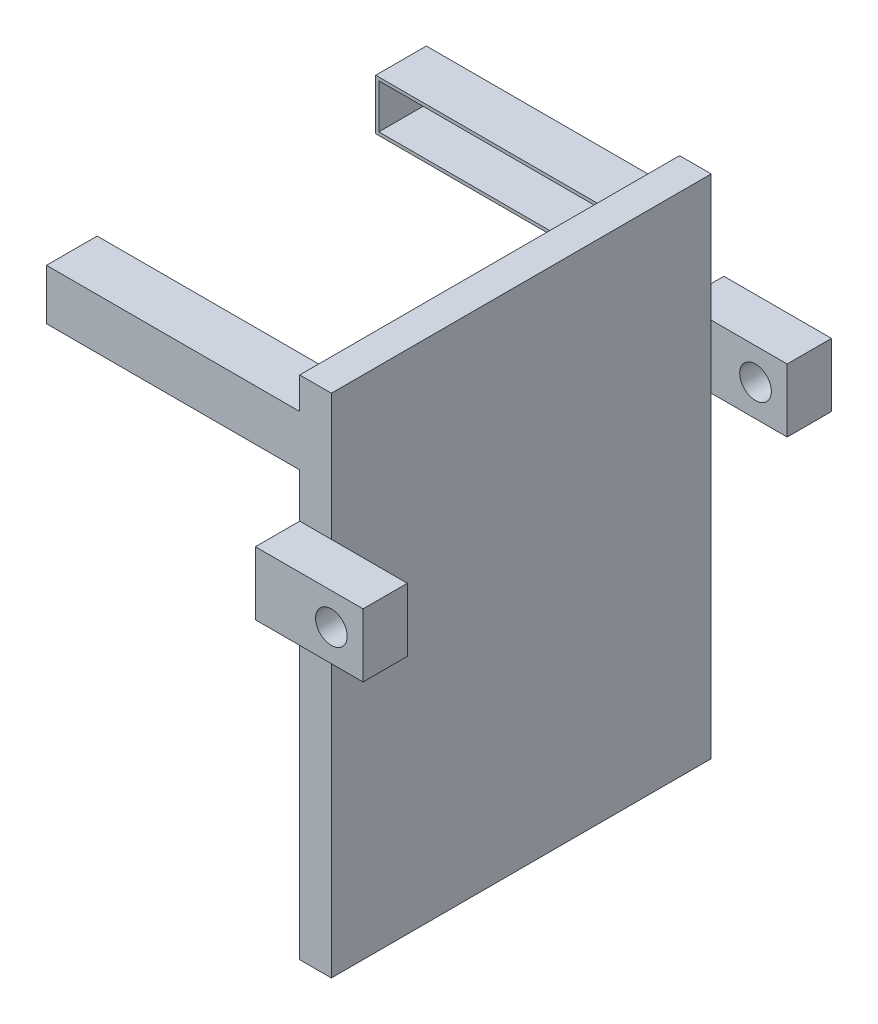
ISO-10303-21;
HEADER;
FILE_DESCRIPTION(('STEP AP214'),'2;1');
FILE_NAME('part.step','',(''),(''),'','','');
FILE_SCHEMA(('AUTOMOTIVE_DESIGN { 1 0 10303 214 1 1 1 1 }'));
ENDSEC;
DATA;
#1=APPLICATION_CONTEXT('core data for automotive mechanical design processes');
#2=APPLICATION_PROTOCOL_DEFINITION('international standard','automotive_design',2000,#1);
#3=PRODUCT_CONTEXT('',#1,'mechanical');
#4=PRODUCT('Part','Part','',(#3));
#5=PRODUCT_RELATED_PRODUCT_CATEGORY('part','',(#4));
#6=PRODUCT_DEFINITION_FORMATION('','',#4);
#7=PRODUCT_DEFINITION_CONTEXT('part definition',#1,'design');
#8=PRODUCT_DEFINITION('design','',#6,#7);
#9=PRODUCT_DEFINITION_SHAPE('','',#8);
#10=(LENGTH_UNIT() NAMED_UNIT(*) SI_UNIT(.MILLI.,.METRE.));
#11=(NAMED_UNIT(*) PLANE_ANGLE_UNIT() SI_UNIT($,.RADIAN.));
#12=(NAMED_UNIT(*) SI_UNIT($,.STERADIAN.) SOLID_ANGLE_UNIT());
#13=UNCERTAINTY_MEASURE_WITH_UNIT(LENGTH_MEASURE(1.E-05),#10,'distance_accuracy_value','');
#14=(GEOMETRIC_REPRESENTATION_CONTEXT(3) GLOBAL_UNCERTAINTY_ASSIGNED_CONTEXT((#13)) GLOBAL_UNIT_ASSIGNED_CONTEXT((#10,
#11,#12)) REPRESENTATION_CONTEXT('',''));
#15=CARTESIAN_POINT('',(0.,0.,0.));
#16=DIRECTION('',(0.,0.,1.));
#17=DIRECTION('',(1.,0.,0.));
#18=AXIS2_PLACEMENT_3D('',#15,#16,#17);
#19=CARTESIAN_POINT('',(0.,0.,-4.4));
#20=DIRECTION('',(0.,0.,1.));
#21=DIRECTION('',(-1.,0.,0.));
#22=AXIS2_PLACEMENT_3D('',#19,#20,#21);
#23=PLANE('',#22);
#24=DIRECTION('',(0.,1.,0.));
#25=VECTOR('',#24,1.);
#26=CARTESIAN_POINT('',(0.,0.4,-4.4));
#27=LINE('',#26,#25);
#28=CARTESIAN_POINT('',(0.,-0.4,-4.4));
#29=VERTEX_POINT('',#28);
#30=CARTESIAN_POINT('',(0.,0.4,-4.4));
#31=VERTEX_POINT('',#30);
#32=EDGE_CURVE('E309',#29,#31,#27,.T.);
#33=ORIENTED_EDGE('',*,*,#32,.T.);
#34=DIRECTION('',(-1.,0.,0.));
#35=VECTOR('',#34,1.);
#36=CARTESIAN_POINT('',(-4.,0.4,-4.4));
#37=LINE('',#36,#35);
#38=CARTESIAN_POINT('',(-4.,0.4,-4.4));
#39=VERTEX_POINT('',#38);
#40=EDGE_CURVE('E314',#31,#39,#37,.T.);
#41=ORIENTED_EDGE('',*,*,#40,.T.);
#42=DIRECTION('',(0.,-1.,0.));
#43=VECTOR('',#42,1.);
#44=CARTESIAN_POINT('',(-4.,-0.4,-4.4));
#45=LINE('',#44,#43);
#46=CARTESIAN_POINT('',(-4.,-0.4,-4.4));
#47=VERTEX_POINT('',#46);
#48=EDGE_CURVE('E326',#39,#47,#45,.T.);
#49=ORIENTED_EDGE('',*,*,#48,.T.);
#50=DIRECTION('',(1.,0.,0.));
#51=VECTOR('',#50,1.);
#52=CARTESIAN_POINT('',(0.,-0.4,-4.4));
#53=LINE('',#52,#51);
#54=EDGE_CURVE('E323',#47,#29,#53,.T.);
#55=ORIENTED_EDGE('',*,*,#54,.T.);
#56=EDGE_LOOP('',(#33,#41,#49,#55));
#57=FACE_BOUND('',#56,.T.);
#58=DIRECTION('',(-1.,0.,0.));
#59=VECTOR('',#58,1.);
#60=CARTESIAN_POINT('',(-0.05,-0.35,-4.4));
#61=LINE('',#60,#59);
#62=CARTESIAN_POINT('',(-0.05,-0.35,-4.4));
#63=VERTEX_POINT('',#62);
#64=CARTESIAN_POINT('',(-3.95,-0.35,-4.4));
#65=VERTEX_POINT('',#64);
#66=EDGE_CURVE('E267',#63,#65,#61,.T.);
#67=ORIENTED_EDGE('',*,*,#66,.T.);
#68=DIRECTION('',(0.,1.,0.));
#69=VECTOR('',#68,1.);
#70=CARTESIAN_POINT('',(-3.95,0.350000000000001,-4.4));
#71=LINE('',#70,#69);
#72=CARTESIAN_POINT('',(-3.95,0.350000000000001,-4.4));
#73=VERTEX_POINT('',#72);
#74=EDGE_CURVE('E57',#65,#73,#71,.T.);
#75=ORIENTED_EDGE('',*,*,#74,.T.);
#76=DIRECTION('',(1.,0.,0.));
#77=VECTOR('',#76,1.);
#78=CARTESIAN_POINT('',(-3.95,0.350000000000001,-4.4));
#79=LINE('',#78,#77);
#80=CARTESIAN_POINT('',(-0.05,0.35,-4.4));
#81=VERTEX_POINT('',#80);
#82=EDGE_CURVE('E258',#73,#81,#79,.T.);
#83=ORIENTED_EDGE('',*,*,#82,.T.);
#84=DIRECTION('',(0.,-1.,0.));
#85=VECTOR('',#84,1.);
#86=CARTESIAN_POINT('',(-0.05,-0.35,-4.4));
#87=LINE('',#86,#85);
#88=EDGE_CURVE('E261',#81,#63,#87,.T.);
#89=ORIENTED_EDGE('',*,*,#88,.T.);
#90=EDGE_LOOP('',(#67,#75,#83,#89));
#91=FACE_BOUND('',#90,.T.);
#92=ADVANCED_FACE('F39',(#57,#91),#23,.T.);
#93=CARTESIAN_POINT('',(0.,0.,-5.2));
#94=DIRECTION('',(0.,0.,-1.));
#95=DIRECTION('',(-1.,0.,0.));
#96=AXIS2_PLACEMENT_3D('',#93,#94,#95);
#97=PLANE('',#96);
#98=DIRECTION('',(0.,-1.,0.));
#99=VECTOR('',#98,1.);
#100=CARTESIAN_POINT('',(0.,-7.1,-5.2));
#101=LINE('',#100,#99);
#102=CARTESIAN_POINT('',(0.,-2.1,-5.2));
#103=VERTEX_POINT('',#102);
#104=CARTESIAN_POINT('',(0.,-7.1,-5.2));
#105=VERTEX_POINT('',#104);
#106=EDGE_CURVE('E420',#103,#105,#101,.T.);
#107=ORIENTED_EDGE('',*,*,#106,.F.);
#108=DIRECTION('',(1.,0.,0.));
#109=VECTOR('',#108,1.);
#110=CARTESIAN_POINT('',(1.7,-2.1,-5.2));
#111=LINE('',#110,#109);
#112=CARTESIAN_POINT('',(0.5,-2.1,-5.2));
#113=VERTEX_POINT('',#112);
#114=EDGE_CURVE('E296',#103,#113,#111,.T.);
#115=ORIENTED_EDGE('',*,*,#114,.T.);
#116=DIRECTION('',(0.,1.,0.));
#117=VECTOR('',#116,1.);
#118=CARTESIAN_POINT('',(0.5,0.9,-5.2));
#119=LINE('',#118,#117);
#120=CARTESIAN_POINT('',(0.5,-7.1,-5.2));
#121=VERTEX_POINT('',#120);
#122=EDGE_CURVE('E413',#121,#113,#119,.T.);
#123=ORIENTED_EDGE('',*,*,#122,.F.);
#124=DIRECTION('',(1.,0.,0.));
#125=VECTOR('',#124,1.);
#126=CARTESIAN_POINT('',(0.5,-7.1,-5.2));
#127=LINE('',#126,#125);
#128=EDGE_CURVE('E408',#105,#121,#127,.T.);
#129=ORIENTED_EDGE('',*,*,#128,.F.);
#130=EDGE_LOOP('',(#107,#115,#123,#129));
#131=FACE_BOUND('',#130,.T.);
#132=ADVANCED_FACE('F535',(#131),#97,.T.);
#133=CARTESIAN_POINT('',(0.5,-1.1,-5.2));
#134=VERTEX_POINT('',#133);
#135=CARTESIAN_POINT('',(0.5,0.9,-5.2));
#136=VERTEX_POINT('',#135);
#137=EDGE_CURVE('E411',#134,#136,#119,.T.);
#138=ORIENTED_EDGE('',*,*,#137,.F.);
#139=DIRECTION('',(-1.,0.,0.));
#140=VECTOR('',#139,1.);
#141=CARTESIAN_POINT('',(0.,-1.1,-5.2));
#142=LINE('',#141,#140);
#143=CARTESIAN_POINT('',(0.,-1.1,-5.2));
#144=VERTEX_POINT('',#143);
#145=EDGE_CURVE('E11',#134,#144,#142,.T.);
#146=ORIENTED_EDGE('',*,*,#145,.T.);
#147=CARTESIAN_POINT('',(0.,-0.4,-5.2));
#148=VERTEX_POINT('',#147);
#149=EDGE_CURVE('E424',#148,#144,#101,.T.);
#150=ORIENTED_EDGE('',*,*,#149,.F.);
#151=DIRECTION('',(1.,0.,0.));
#152=VECTOR('',#151,1.);
#153=CARTESIAN_POINT('',(0.,-0.4,-5.2));
#154=LINE('',#153,#152);
#155=CARTESIAN_POINT('',(-4.,-0.4,-5.2));
#156=VERTEX_POINT('',#155);
#157=EDGE_CURVE('E310',#156,#148,#154,.T.);
#158=ORIENTED_EDGE('',*,*,#157,.F.);
#159=DIRECTION('',(0.,-1.,0.));
#160=VECTOR('',#159,1.);
#161=CARTESIAN_POINT('',(-4.,-0.4,-5.2));
#162=LINE('',#161,#160);
#163=CARTESIAN_POINT('',(-4.,0.4,-5.2));
#164=VERTEX_POINT('',#163);
#165=EDGE_CURVE('E313',#164,#156,#162,.T.);
#166=ORIENTED_EDGE('',*,*,#165,.F.);
#167=DIRECTION('',(-1.,0.,0.));
#168=VECTOR('',#167,1.);
#169=CARTESIAN_POINT('',(-4.,0.4,-5.2));
#170=LINE('',#169,#168);
#171=CARTESIAN_POINT('',(0.,0.4,-5.2));
#172=VERTEX_POINT('',#171);
#173=EDGE_CURVE('E317',#172,#164,#170,.T.);
#174=ORIENTED_EDGE('',*,*,#173,.F.);
#175=CARTESIAN_POINT('',(0.,0.9,-5.2));
#176=VERTEX_POINT('',#175);
#177=EDGE_CURVE('E421',#176,#172,#101,.T.);
#178=ORIENTED_EDGE('',*,*,#177,.F.);
#179=DIRECTION('',(-1.,0.,0.));
#180=VECTOR('',#179,1.);
#181=CARTESIAN_POINT('',(0.5,0.9,-5.2));
#182=LINE('',#181,#180);
#183=EDGE_CURVE('E416',#136,#176,#182,.T.);
#184=ORIENTED_EDGE('',*,*,#183,.F.);
#185=EDGE_LOOP('',(#138,#146,#150,#158,#166,#174,#178,#184));
#186=FACE_BOUND('',#185,.T.);
#187=ADVANCED_FACE('F546',(#186),#97,.T.);
#188=CARTESIAN_POINT('',(0.,0.,0.8));
#189=DIRECTION('',(0.,0.,-1.));
#190=DIRECTION('',(-1.,0.,0.));
#191=AXIS2_PLACEMENT_3D('',#188,#189,#190);
#192=PLANE('',#191);
#193=DIRECTION('',(1.,0.,0.));
#194=VECTOR('',#193,1.);
#195=CARTESIAN_POINT('',(1.7,-2.1,0.8));
#196=LINE('',#195,#194);
#197=CARTESIAN_POINT('',(0.,-2.1,0.8));
#198=VERTEX_POINT('',#197);
#199=CARTESIAN_POINT('',(0.5,-2.1,0.8));
#200=VERTEX_POINT('',#199);
#201=EDGE_CURVE('E357',#198,#200,#196,.T.);
#202=ORIENTED_EDGE('',*,*,#201,.F.);
#203=DIRECTION('',(0.,-1.,0.));
#204=VECTOR('',#203,1.);
#205=CARTESIAN_POINT('',(0.,-7.1,0.8));
#206=LINE('',#205,#204);
#207=CARTESIAN_POINT('',(0.,-7.1,0.8));
#208=VERTEX_POINT('',#207);
#209=EDGE_CURVE('E435',#198,#208,#206,.T.);
#210=ORIENTED_EDGE('',*,*,#209,.T.);
#211=DIRECTION('',(1.,0.,0.));
#212=VECTOR('',#211,1.);
#213=CARTESIAN_POINT('',(0.5,-7.1,0.8));
#214=LINE('',#213,#212);
#215=CARTESIAN_POINT('',(0.5,-7.1,0.8));
#216=VERTEX_POINT('',#215);
#217=EDGE_CURVE('E401',#208,#216,#214,.T.);
#218=ORIENTED_EDGE('',*,*,#217,.T.);
#219=DIRECTION('',(0.,1.,0.));
#220=VECTOR('',#219,1.);
#221=CARTESIAN_POINT('',(0.5,0.9,0.8));
#222=LINE('',#221,#220);
#223=EDGE_CURVE('E428',#216,#200,#222,.T.);
#224=ORIENTED_EDGE('',*,*,#223,.T.);
#225=EDGE_LOOP('',(#202,#210,#218,#224));
#226=FACE_BOUND('',#225,.T.);
#227=ADVANCED_FACE('F526',(#226),#192,.F.);
#228=DIRECTION('',(-1.,0.,0.));
#229=VECTOR('',#228,1.);
#230=CARTESIAN_POINT('',(0.,-1.1,0.8));
#231=LINE('',#230,#229);
#232=CARTESIAN_POINT('',(0.5,-1.1,0.8));
#233=VERTEX_POINT('',#232);
#234=CARTESIAN_POINT('',(0.,-1.1,0.8));
#235=VERTEX_POINT('',#234);
#236=EDGE_CURVE('E48',#233,#235,#231,.T.);
#237=ORIENTED_EDGE('',*,*,#236,.F.);
#238=CARTESIAN_POINT('',(0.5,0.9,0.8));
#239=VERTEX_POINT('',#238);
#240=EDGE_CURVE('E427',#233,#239,#222,.T.);
#241=ORIENTED_EDGE('',*,*,#240,.T.);
#242=DIRECTION('',(-1.,0.,0.));
#243=VECTOR('',#242,1.);
#244=CARTESIAN_POINT('',(0.5,0.9,0.8));
#245=LINE('',#244,#243);
#246=CARTESIAN_POINT('',(0.,0.9,0.8));
#247=VERTEX_POINT('',#246);
#248=EDGE_CURVE('E431',#239,#247,#245,.T.);
#249=ORIENTED_EDGE('',*,*,#248,.T.);
#250=CARTESIAN_POINT('',(0.,0.4,0.8));
#251=VERTEX_POINT('',#250);
#252=EDGE_CURVE('E412',#247,#251,#206,.T.);
#253=ORIENTED_EDGE('',*,*,#252,.T.);
#254=DIRECTION('',(-1.,0.,0.));
#255=VECTOR('',#254,1.);
#256=CARTESIAN_POINT('',(-4.,0.4,0.8));
#257=LINE('',#256,#255);
#258=CARTESIAN_POINT('',(-4.,0.4,0.8));
#259=VERTEX_POINT('',#258);
#260=EDGE_CURVE('E449',#251,#259,#257,.T.);
#261=ORIENTED_EDGE('',*,*,#260,.T.);
#262=DIRECTION('',(0.,-1.,0.));
#263=VECTOR('',#262,1.);
#264=CARTESIAN_POINT('',(-4.,-0.4,0.8));
#265=LINE('',#264,#263);
#266=CARTESIAN_POINT('',(-4.,-0.4,0.8));
#267=VERTEX_POINT('',#266);
#268=EDGE_CURVE('E451',#259,#267,#265,.T.);
#269=ORIENTED_EDGE('',*,*,#268,.T.);
#270=DIRECTION('',(1.,0.,0.));
#271=VECTOR('',#270,1.);
#272=CARTESIAN_POINT('',(0.,-0.4,0.8));
#273=LINE('',#272,#271);
#274=CARTESIAN_POINT('',(0.,-0.4,0.8));
#275=VERTEX_POINT('',#274);
#276=EDGE_CURVE('E454',#267,#275,#273,.T.);
#277=ORIENTED_EDGE('',*,*,#276,.T.);
#278=EDGE_CURVE('E438',#275,#235,#206,.T.);
#279=ORIENTED_EDGE('',*,*,#278,.T.);
#280=EDGE_LOOP('',(#237,#241,#249,#253,#261,#269,#277,#279));
#281=FACE_BOUND('',#280,.T.);
#282=ADVANCED_FACE('F506',(#281),#192,.F.);
#283=CARTESIAN_POINT('',(-4.,0.4,0.8));
#284=DIRECTION('',(0.,-1.,0.));
#285=DIRECTION('',(1.,0.,0.));
#286=AXIS2_PLACEMENT_3D('',#283,#284,#285);
#287=PLANE('',#286);
#288=DIRECTION('',(-1.,0.,0.));
#289=VECTOR('',#288,1.);
#290=CARTESIAN_POINT('',(-4.,0.4,0.));
#291=LINE('',#290,#289);
#292=CARTESIAN_POINT('',(0.,0.4,0.));
#293=VERTEX_POINT('',#292);
#294=CARTESIAN_POINT('',(-4.,0.4,0.));
#295=VERTEX_POINT('',#294);
#296=EDGE_CURVE('E459',#293,#295,#291,.T.);
#297=ORIENTED_EDGE('',*,*,#296,.T.);
#298=DIRECTION('',(0.,0.,-1.));
#299=VECTOR('',#298,1.);
#300=CARTESIAN_POINT('',(-4.,0.4,0.8));
#301=LINE('',#300,#299);
#302=EDGE_CURVE('E469',#259,#295,#301,.T.);
#303=ORIENTED_EDGE('',*,*,#302,.F.);
#304=ORIENTED_EDGE('',*,*,#260,.F.);
#305=DIRECTION('',(0.,0.,-1.));
#306=VECTOR('',#305,1.);
#307=CARTESIAN_POINT('',(0.,0.4,0.8));
#308=LINE('',#307,#306);
#309=EDGE_CURVE('E43',#251,#293,#308,.T.);
#310=ORIENTED_EDGE('',*,*,#309,.T.);
#311=EDGE_LOOP('',(#297,#303,#304,#310));
#312=FACE_BOUND('',#311,.T.);
#313=ADVANCED_FACE('F41',(#312),#287,.F.);
#314=CARTESIAN_POINT('',(-4.,-0.4,0.8));
#315=DIRECTION('',(1.,0.,0.));
#316=DIRECTION('',(0.,0.,-1.));
#317=AXIS2_PLACEMENT_3D('',#314,#315,#316);
#318=PLANE('',#317);
#319=DIRECTION('',(0.,-1.,0.));
#320=VECTOR('',#319,1.);
#321=CARTESIAN_POINT('',(-4.,-0.4,0.));
#322=LINE('',#321,#320);
#323=CARTESIAN_POINT('',(-4.,-0.4,0.));
#324=VERTEX_POINT('',#323);
#325=EDGE_CURVE('E461',#295,#324,#322,.T.);
#326=ORIENTED_EDGE('',*,*,#325,.T.);
#327=DIRECTION('',(0.,0.,-1.));
#328=VECTOR('',#327,1.);
#329=CARTESIAN_POINT('',(-4.,-0.4,0.8));
#330=LINE('',#329,#328);
#331=EDGE_CURVE('E467',#267,#324,#330,.T.);
#332=ORIENTED_EDGE('',*,*,#331,.F.);
#333=ORIENTED_EDGE('',*,*,#268,.F.);
#334=ORIENTED_EDGE('',*,*,#302,.T.);
#335=EDGE_LOOP('',(#326,#332,#333,#334));
#336=FACE_BOUND('',#335,.T.);
#337=ADVANCED_FACE('F519',(#336),#318,.F.);
#338=CARTESIAN_POINT('',(0.,-0.4,0.8));
#339=DIRECTION('',(0.,1.,0.));
#340=DIRECTION('',(-1.,0.,0.));
#341=AXIS2_PLACEMENT_3D('',#338,#339,#340);
#342=PLANE('',#341);
#343=DIRECTION('',(1.,0.,0.));
#344=VECTOR('',#343,1.);
#345=CARTESIAN_POINT('',(0.,-0.4,0.));
#346=LINE('',#345,#344);
#347=CARTESIAN_POINT('',(0.,-0.4,0.));
#348=VERTEX_POINT('',#347);
#349=EDGE_CURVE('E452',#324,#348,#346,.T.);
#350=ORIENTED_EDGE('',*,*,#349,.T.);
#351=DIRECTION('',(0.,0.,-1.));
#352=VECTOR('',#351,1.);
#353=CARTESIAN_POINT('',(0.,-0.4,0.8));
#354=LINE('',#353,#352);
#355=EDGE_CURVE('E456',#275,#348,#354,.T.);
#356=ORIENTED_EDGE('',*,*,#355,.F.);
#357=ORIENTED_EDGE('',*,*,#276,.F.);
#358=ORIENTED_EDGE('',*,*,#331,.T.);
#359=EDGE_LOOP('',(#350,#356,#357,#358));
#360=FACE_BOUND('',#359,.T.);
#361=ADVANCED_FACE('F524',(#360),#342,.F.);
#362=CARTESIAN_POINT('',(0.,0.,0.));
#363=DIRECTION('',(0.,0.,-1.));
#364=DIRECTION('',(-1.,0.,0.));
#365=AXIS2_PLACEMENT_3D('',#362,#363,#364);
#366=PLANE('',#365);
#367=DIRECTION('',(0.,1.,0.));
#368=VECTOR('',#367,1.);
#369=CARTESIAN_POINT('',(-3.95,0.350000000000001,0.));
#370=LINE('',#369,#368);
#371=CARTESIAN_POINT('',(-3.95,-0.35,0.));
#372=VERTEX_POINT('',#371);
#373=CARTESIAN_POINT('',(-3.95,0.350000000000001,0.));
#374=VERTEX_POINT('',#373);
#375=EDGE_CURVE('E375',#372,#374,#370,.T.);
#376=ORIENTED_EDGE('',*,*,#375,.F.);
#377=DIRECTION('',(-1.,0.,0.));
#378=VECTOR('',#377,1.);
#379=CARTESIAN_POINT('',(-0.05,-0.35,0.));
#380=LINE('',#379,#378);
#381=CARTESIAN_POINT('',(-0.05,-0.35,0.));
#382=VERTEX_POINT('',#381);
#383=EDGE_CURVE('E380',#382,#372,#380,.T.);
#384=ORIENTED_EDGE('',*,*,#383,.F.);
#385=DIRECTION('',(0.,-1.,0.));
#386=VECTOR('',#385,1.);
#387=CARTESIAN_POINT('',(-0.05,-0.35,0.));
#388=LINE('',#387,#386);
#389=CARTESIAN_POINT('',(-0.05,0.35,0.));
#390=VERTEX_POINT('',#389);
#391=EDGE_CURVE('E394',#390,#382,#388,.T.);
#392=ORIENTED_EDGE('',*,*,#391,.F.);
#393=DIRECTION('',(1.,0.,0.));
#394=VECTOR('',#393,1.);
#395=CARTESIAN_POINT('',(-3.95,0.350000000000001,0.));
#396=LINE('',#395,#394);
#397=EDGE_CURVE('E391',#374,#390,#396,.T.);
#398=ORIENTED_EDGE('',*,*,#397,.F.);
#399=EDGE_LOOP('',(#376,#384,#392,#398));
#400=FACE_BOUND('',#399,.T.);
#401=DIRECTION('',(0.,1.,0.));
#402=VECTOR('',#401,1.);
#403=CARTESIAN_POINT('',(0.,0.4,0.));
#404=LINE('',#403,#402);
#405=EDGE_CURVE('E442',#348,#293,#404,.T.);
#406=ORIENTED_EDGE('',*,*,#405,.F.);
#407=ORIENTED_EDGE('',*,*,#349,.F.);
#408=ORIENTED_EDGE('',*,*,#325,.F.);
#409=ORIENTED_EDGE('',*,*,#296,.F.);
#410=EDGE_LOOP('',(#406,#407,#408,#409));
#411=FACE_BOUND('',#410,.T.);
#412=ADVANCED_FACE('F698',(#400,#411),#366,.T.);
#413=CARTESIAN_POINT('',(0.,-7.1,-5.2));
#414=DIRECTION('',(-1.,0.,0.));
#415=DIRECTION('',(0.,0.,1.));
#416=AXIS2_PLACEMENT_3D('',#413,#414,#415);
#417=PLANE('',#416);
#418=DIRECTION('',(0.,0.,1.));
#419=VECTOR('',#418,1.);
#420=CARTESIAN_POINT('',(0.,-0.4,-5.2));
#421=LINE('',#420,#419);
#422=EDGE_CURVE('E336',#148,#29,#421,.T.);
#423=ORIENTED_EDGE('',*,*,#422,.F.);
#424=ORIENTED_EDGE('',*,*,#149,.T.);
#425=DIRECTION('',(0.,0.,1.));
#426=VECTOR('',#425,1.);
#427=CARTESIAN_POINT('',(0.,-1.1,-5.9));
#428=LINE('',#427,#426);
#429=CARTESIAN_POINT('',(0.,-1.1,-5.9));
#430=VERTEX_POINT('',#429);
#431=EDGE_CURVE('E65',#430,#144,#428,.T.);
#432=ORIENTED_EDGE('',*,*,#431,.F.);
#433=DIRECTION('',(0.,-1.,0.));
#434=VECTOR('',#433,1.);
#435=CARTESIAN_POINT('',(0.,-1.1,-5.9));
#436=LINE('',#435,#434);
#437=CARTESIAN_POINT('',(0.,-2.1,-5.9));
#438=VERTEX_POINT('',#437);
#439=EDGE_CURVE('E286',#430,#438,#436,.T.);
#440=ORIENTED_EDGE('',*,*,#439,.T.);
#441=DIRECTION('',(0.,0.,1.));
#442=VECTOR('',#441,1.);
#443=CARTESIAN_POINT('',(0.,-2.1,-5.9));
#444=LINE('',#443,#442);
#445=EDGE_CURVE('E307',#438,#103,#444,.T.);
#446=ORIENTED_EDGE('',*,*,#445,.T.);
#447=ORIENTED_EDGE('',*,*,#106,.T.);
#448=DIRECTION('',(0.,0.,1.));
#449=VECTOR('',#448,1.);
#450=CARTESIAN_POINT('',(0.,-7.1,-5.2));
#451=LINE('',#450,#449);
#452=EDGE_CURVE('E439',#105,#208,#451,.T.);
#453=ORIENTED_EDGE('',*,*,#452,.T.);
#454=ORIENTED_EDGE('',*,*,#209,.F.);
#455=DIRECTION('',(0.,0.,-1.));
#456=VECTOR('',#455,1.);
#457=CARTESIAN_POINT('',(0.,-2.1,1.5));
#458=LINE('',#457,#456);
#459=CARTESIAN_POINT('',(0.,-2.1,1.5));
#460=VERTEX_POINT('',#459);
#461=EDGE_CURVE('E356',#460,#198,#458,.T.);
#462=ORIENTED_EDGE('',*,*,#461,.F.);
#463=DIRECTION('',(0.,-1.,0.));
#464=VECTOR('',#463,1.);
#465=CARTESIAN_POINT('',(0.,-1.1,1.5));
#466=LINE('',#465,#464);
#467=CARTESIAN_POINT('',(0.,-1.1,1.5));
#468=VERTEX_POINT('',#467);
#469=EDGE_CURVE('E354',#468,#460,#466,.T.);
#470=ORIENTED_EDGE('',*,*,#469,.F.);
#471=DIRECTION('',(0.,0.,-1.));
#472=VECTOR('',#471,1.);
#473=CARTESIAN_POINT('',(0.,-1.1,1.5));
#474=LINE('',#473,#472);
#475=EDGE_CURVE('E366',#468,#235,#474,.T.);
#476=ORIENTED_EDGE('',*,*,#475,.T.);
#477=ORIENTED_EDGE('',*,*,#278,.F.);
#478=ORIENTED_EDGE('',*,*,#355,.T.);
#479=ORIENTED_EDGE('',*,*,#405,.T.);
#480=ORIENTED_EDGE('',*,*,#309,.F.);
#481=ORIENTED_EDGE('',*,*,#252,.F.);
#482=DIRECTION('',(0.,0.,1.));
#483=VECTOR('',#482,1.);
#484=CARTESIAN_POINT('',(0.,0.9,-5.2));
#485=LINE('',#484,#483);
#486=EDGE_CURVE('E443',#176,#247,#485,.T.);
#487=ORIENTED_EDGE('',*,*,#486,.F.);
#488=ORIENTED_EDGE('',*,*,#177,.T.);
#489=DIRECTION('',(0.,0.,1.));
#490=VECTOR('',#489,1.);
#491=CARTESIAN_POINT('',(0.,0.4,-5.2));
#492=LINE('',#491,#490);
#493=EDGE_CURVE('E320',#172,#31,#492,.T.);
#494=ORIENTED_EDGE('',*,*,#493,.T.);
#495=ORIENTED_EDGE('',*,*,#32,.F.);
#496=EDGE_LOOP('',(#423,#424,#432,#440,#446,#447,#453,#454,#462,#470,#476,#477,#478,#479,#480,
#481,#487,#488,#494,#495));
#497=FACE_BOUND('',#496,.T.);
#498=ADVANCED_FACE('F490',(#497),#417,.T.);
#499=CARTESIAN_POINT('',(0.5,-7.1,-5.2));
#500=DIRECTION('',(0.,-1.,0.));
#501=DIRECTION('',(0.,0.,-1.));
#502=AXIS2_PLACEMENT_3D('',#499,#500,#501);
#503=PLANE('',#502);
#504=ORIENTED_EDGE('',*,*,#217,.F.);
#505=ORIENTED_EDGE('',*,*,#452,.F.);
#506=ORIENTED_EDGE('',*,*,#128,.T.);
#507=DIRECTION('',(0.,0.,1.));
#508=VECTOR('',#507,1.);
#509=CARTESIAN_POINT('',(0.5,-7.1,-5.2));
#510=LINE('',#509,#508);
#511=EDGE_CURVE('E423',#121,#216,#510,.T.);
#512=ORIENTED_EDGE('',*,*,#511,.T.);
#513=EDGE_LOOP('',(#504,#505,#506,#512));
#514=FACE_BOUND('',#513,.T.);
#515=ADVANCED_FACE('F532',(#514),#503,.T.);
#516=CARTESIAN_POINT('',(0.5,0.9,-5.2));
#517=DIRECTION('',(0.,1.,0.));
#518=DIRECTION('',(0.,0.,1.));
#519=AXIS2_PLACEMENT_3D('',#516,#517,#518);
#520=PLANE('',#519);
#521=ORIENTED_EDGE('',*,*,#248,.F.);
#522=DIRECTION('',(0.,0.,1.));
#523=VECTOR('',#522,1.);
#524=CARTESIAN_POINT('',(0.5,0.9,-5.2));
#525=LINE('',#524,#523);
#526=EDGE_CURVE('E445',#136,#239,#525,.T.);
#527=ORIENTED_EDGE('',*,*,#526,.F.);
#528=ORIENTED_EDGE('',*,*,#183,.T.);
#529=ORIENTED_EDGE('',*,*,#486,.T.);
#530=EDGE_LOOP('',(#521,#527,#528,#529));
#531=FACE_BOUND('',#530,.T.);
#532=ADVANCED_FACE('F515',(#531),#520,.T.);
#533=CARTESIAN_POINT('',(0.5,0.9,-5.2));
#534=DIRECTION('',(1.,0.,0.));
#535=DIRECTION('',(0.,0.,-1.));
#536=AXIS2_PLACEMENT_3D('',#533,#534,#535);
#537=PLANE('',#536);
#538=ORIENTED_EDGE('',*,*,#223,.F.);
#539=ORIENTED_EDGE('',*,*,#511,.F.);
#540=ORIENTED_EDGE('',*,*,#122,.T.);
#541=EDGE_CURVE('E417',#113,#134,#119,.T.);
#542=ORIENTED_EDGE('',*,*,#541,.T.);
#543=ORIENTED_EDGE('',*,*,#137,.T.);
#544=ORIENTED_EDGE('',*,*,#526,.T.);
#545=ORIENTED_EDGE('',*,*,#240,.F.);
#546=EDGE_CURVE('E432',#200,#233,#222,.T.);
#547=ORIENTED_EDGE('',*,*,#546,.F.);
#548=EDGE_LOOP('',(#538,#539,#540,#542,#543,#544,#545,#547));
#549=FACE_BOUND('',#548,.T.);
#550=ADVANCED_FACE('F510',(#549),#537,.T.);
#551=CARTESIAN_POINT('',(-3.95,0.350000000000001,0.7));
#552=DIRECTION('',(-1.,0.,0.));
#553=DIRECTION('',(0.,0.,1.));
#554=AXIS2_PLACEMENT_3D('',#551,#552,#553);
#555=PLANE('',#554);
#556=ORIENTED_EDGE('',*,*,#375,.T.);
#557=DIRECTION('',(0.,0.,-1.));
#558=VECTOR('',#557,1.);
#559=CARTESIAN_POINT('',(-3.95,0.350000000000001,0.7));
#560=LINE('',#559,#558);
#561=CARTESIAN_POINT('',(-3.95,0.350000000000001,0.7));
#562=VERTEX_POINT('',#561);
#563=EDGE_CURVE('E389',#562,#374,#560,.T.);
#564=ORIENTED_EDGE('',*,*,#563,.F.);
#565=DIRECTION('',(0.,1.,0.));
#566=VECTOR('',#565,1.);
#567=CARTESIAN_POINT('',(-3.95,0.350000000000001,0.7));
#568=LINE('',#567,#566);
#569=CARTESIAN_POINT('',(-3.95,-0.35,0.7));
#570=VERTEX_POINT('',#569);
#571=EDGE_CURVE('E376',#570,#562,#568,.T.);
#572=ORIENTED_EDGE('',*,*,#571,.F.);
#573=DIRECTION('',(0.,0.,-1.));
#574=VECTOR('',#573,1.);
#575=CARTESIAN_POINT('',(-3.95,-0.35,0.7));
#576=LINE('',#575,#574);
#577=EDGE_CURVE('E399',#570,#372,#576,.T.);
#578=ORIENTED_EDGE('',*,*,#577,.T.);
#579=EDGE_LOOP('',(#556,#564,#572,#578));
#580=FACE_BOUND('',#579,.T.);
#581=ADVANCED_FACE('F683',(#580),#555,.F.);
#582=CARTESIAN_POINT('',(-0.05,-0.35,0.7));
#583=DIRECTION('',(0.,-1.,0.));
#584=DIRECTION('',(0.,0.,-1.));
#585=AXIS2_PLACEMENT_3D('',#582,#583,#584);
#586=PLANE('',#585);
#587=ORIENTED_EDGE('',*,*,#383,.T.);
#588=ORIENTED_EDGE('',*,*,#577,.F.);
#589=DIRECTION('',(-1.,0.,0.));
#590=VECTOR('',#589,1.);
#591=CARTESIAN_POINT('',(-0.05,-0.35,0.7));
#592=LINE('',#591,#590);
#593=CARTESIAN_POINT('',(-0.05,-0.35,0.7));
#594=VERTEX_POINT('',#593);
#595=EDGE_CURVE('E386',#594,#570,#592,.T.);
#596=ORIENTED_EDGE('',*,*,#595,.F.);
#597=DIRECTION('',(0.,0.,-1.));
#598=VECTOR('',#597,1.);
#599=CARTESIAN_POINT('',(-0.05,-0.35,0.7));
#600=LINE('',#599,#598);
#601=EDGE_CURVE('E402',#594,#382,#600,.T.);
#602=ORIENTED_EDGE('',*,*,#601,.T.);
#603=EDGE_LOOP('',(#587,#588,#596,#602));
#604=FACE_BOUND('',#603,.T.);
#605=ADVANCED_FACE('F823',(#604),#586,.F.);
#606=CARTESIAN_POINT('',(-0.05,-0.35,0.7));
#607=DIRECTION('',(1.,0.,0.));
#608=DIRECTION('',(0.,0.,-1.));
#609=AXIS2_PLACEMENT_3D('',#606,#607,#608);
#610=PLANE('',#609);
#611=ORIENTED_EDGE('',*,*,#391,.T.);
#612=ORIENTED_EDGE('',*,*,#601,.F.);
#613=DIRECTION('',(0.,-1.,0.));
#614=VECTOR('',#613,1.);
#615=CARTESIAN_POINT('',(-0.05,-0.35,0.7));
#616=LINE('',#615,#614);
#617=CARTESIAN_POINT('',(-0.05,0.35,0.7));
#618=VERTEX_POINT('',#617);
#619=EDGE_CURVE('E383',#618,#594,#616,.T.);
#620=ORIENTED_EDGE('',*,*,#619,.F.);
#621=DIRECTION('',(0.,0.,-1.));
#622=VECTOR('',#621,1.);
#623=CARTESIAN_POINT('',(-0.05,0.35,0.7));
#624=LINE('',#623,#622);
#625=EDGE_CURVE('E404',#618,#390,#624,.T.);
#626=ORIENTED_EDGE('',*,*,#625,.T.);
#627=EDGE_LOOP('',(#611,#612,#620,#626));
#628=FACE_BOUND('',#627,.T.);
#629=ADVANCED_FACE('F812',(#628),#610,.F.);
#630=CARTESIAN_POINT('',(-3.95,0.350000000000001,0.7));
#631=DIRECTION('',(0.,1.,0.));
#632=DIRECTION('',(-1.,0.,0.));
#633=AXIS2_PLACEMENT_3D('',#630,#631,#632);
#634=PLANE('',#633);
#635=ORIENTED_EDGE('',*,*,#397,.T.);
#636=ORIENTED_EDGE('',*,*,#625,.F.);
#637=DIRECTION('',(1.,0.,0.));
#638=VECTOR('',#637,1.);
#639=CARTESIAN_POINT('',(-3.95,0.350000000000001,0.7));
#640=LINE('',#639,#638);
#641=EDGE_CURVE('E379',#562,#618,#640,.T.);
#642=ORIENTED_EDGE('',*,*,#641,.F.);
#643=ORIENTED_EDGE('',*,*,#563,.T.);
#644=EDGE_LOOP('',(#635,#636,#642,#643));
#645=FACE_BOUND('',#644,.T.);
#646=ADVANCED_FACE('F801',(#645),#634,.F.);
#647=CARTESIAN_POINT('',(0.,0.,0.7));
#648=DIRECTION('',(0.,0.,-1.));
#649=DIRECTION('',(-1.,0.,0.));
#650=AXIS2_PLACEMENT_3D('',#647,#648,#649);
#651=PLANE('',#650);
#652=ORIENTED_EDGE('',*,*,#571,.T.);
#653=ORIENTED_EDGE('',*,*,#641,.T.);
#654=ORIENTED_EDGE('',*,*,#619,.T.);
#655=ORIENTED_EDGE('',*,*,#595,.T.);
#656=EDGE_LOOP('',(#652,#653,#654,#655));
#657=FACE_BOUND('',#656,.T.);
#658=ADVANCED_FACE('F745',(#657),#651,.T.);
#659=CARTESIAN_POINT('',(0.,0.,0.8));
#660=DIRECTION('',(0.,0.,1.));
#661=DIRECTION('',(1.,0.,0.));
#662=AXIS2_PLACEMENT_3D('',#659,#660,#661);
#663=PLANE('',#662);
#664=CARTESIAN_POINT('',(1.2,-1.6,0.8));
#665=DIRECTION('',(0.,0.,-1.));
#666=DIRECTION('',(-1.,0.,0.));
#667=AXIS2_PLACEMENT_3D('',#664,#665,#666);
#668=CIRCLE('',#667,0.25);
#669=CARTESIAN_POINT('',(0.95,-1.6,0.8));
#670=VERTEX_POINT('',#669);
#671=EDGE_CURVE('E339',#670,#670,#668,.T.);
#672=ORIENTED_EDGE('',*,*,#671,.F.);
#673=EDGE_LOOP('',(#672));
#674=FACE_BOUND('',#673,.T.);
#675=CARTESIAN_POINT('',(1.7,-2.1,0.8));
#676=VERTEX_POINT('',#675);
#677=EDGE_CURVE('E343',#200,#676,#196,.T.);
#678=ORIENTED_EDGE('',*,*,#677,.F.);
#679=ORIENTED_EDGE('',*,*,#546,.T.);
#680=CARTESIAN_POINT('',(1.7,-1.1,0.8));
#681=VERTEX_POINT('',#680);
#682=EDGE_CURVE('E350',#681,#233,#231,.T.);
#683=ORIENTED_EDGE('',*,*,#682,.F.);
#684=DIRECTION('',(0.,1.,0.));
#685=VECTOR('',#684,1.);
#686=CARTESIAN_POINT('',(1.7,-2.1,0.8));
#687=LINE('',#686,#685);
#688=EDGE_CURVE('E360',#676,#681,#687,.T.);
#689=ORIENTED_EDGE('',*,*,#688,.F.);
#690=EDGE_LOOP('',(#678,#679,#683,#689));
#691=FACE_BOUND('',#690,.T.);
#692=ADVANCED_FACE('F503',(#674,#691),#663,.F.);
#693=CARTESIAN_POINT('',(1.7,-2.1,1.5));
#694=DIRECTION('',(0.,1.,0.));
#695=DIRECTION('',(-1.,0.,0.));
#696=AXIS2_PLACEMENT_3D('',#693,#694,#695);
#697=PLANE('',#696);
#698=ORIENTED_EDGE('',*,*,#201,.T.);
#699=ORIENTED_EDGE('',*,*,#677,.T.);
#700=DIRECTION('',(0.,0.,-1.));
#701=VECTOR('',#700,1.);
#702=CARTESIAN_POINT('',(1.7,-2.1,1.5));
#703=LINE('',#702,#701);
#704=CARTESIAN_POINT('',(1.7,-2.1,1.5));
#705=VERTEX_POINT('',#704);
#706=EDGE_CURVE('E372',#705,#676,#703,.T.);
#707=ORIENTED_EDGE('',*,*,#706,.F.);
#708=DIRECTION('',(1.,0.,0.));
#709=VECTOR('',#708,1.);
#710=CARTESIAN_POINT('',(1.7,-2.1,1.5));
#711=LINE('',#710,#709);
#712=EDGE_CURVE('E346',#460,#705,#711,.T.);
#713=ORIENTED_EDGE('',*,*,#712,.F.);
#714=ORIENTED_EDGE('',*,*,#461,.T.);
#715=EDGE_LOOP('',(#698,#699,#707,#713,#714));
#716=FACE_BOUND('',#715,.T.);
#717=ADVANCED_FACE('F744',(#716),#697,.F.);
#718=CARTESIAN_POINT('',(1.7,-2.1,1.5));
#719=DIRECTION('',(-1.,0.,0.));
#720=DIRECTION('',(0.,0.,1.));
#721=AXIS2_PLACEMENT_3D('',#718,#719,#720);
#722=PLANE('',#721);
#723=ORIENTED_EDGE('',*,*,#688,.T.);
#724=DIRECTION('',(0.,0.,-1.));
#725=VECTOR('',#724,1.);
#726=CARTESIAN_POINT('',(1.7,-1.1,1.5));
#727=LINE('',#726,#725);
#728=CARTESIAN_POINT('',(1.7,-1.1,1.5));
#729=VERTEX_POINT('',#728);
#730=EDGE_CURVE('E369',#729,#681,#727,.T.);
#731=ORIENTED_EDGE('',*,*,#730,.F.);
#732=DIRECTION('',(0.,1.,0.));
#733=VECTOR('',#732,1.);
#734=CARTESIAN_POINT('',(1.7,-2.1,1.5));
#735=LINE('',#734,#733);
#736=EDGE_CURVE('E349',#705,#729,#735,.T.);
#737=ORIENTED_EDGE('',*,*,#736,.F.);
#738=ORIENTED_EDGE('',*,*,#706,.T.);
#739=EDGE_LOOP('',(#723,#731,#737,#738));
#740=FACE_BOUND('',#739,.T.);
#741=ADVANCED_FACE('F757',(#740),#722,.F.);
#742=CARTESIAN_POINT('',(0.,-1.1,1.5));
#743=DIRECTION('',(0.,-1.,0.));
#744=DIRECTION('',(0.,0.,-1.));
#745=AXIS2_PLACEMENT_3D('',#742,#743,#744);
#746=PLANE('',#745);
#747=ORIENTED_EDGE('',*,*,#682,.T.);
#748=ORIENTED_EDGE('',*,*,#236,.T.);
#749=ORIENTED_EDGE('',*,*,#475,.F.);
#750=DIRECTION('',(-1.,0.,0.));
#751=VECTOR('',#750,1.);
#752=CARTESIAN_POINT('',(0.,-1.1,1.5));
#753=LINE('',#752,#751);
#754=EDGE_CURVE('E352',#729,#468,#753,.T.);
#755=ORIENTED_EDGE('',*,*,#754,.F.);
#756=ORIENTED_EDGE('',*,*,#730,.T.);
#757=EDGE_LOOP('',(#747,#748,#749,#755,#756));
#758=FACE_BOUND('',#757,.T.);
#759=ADVANCED_FACE('F481',(#758),#746,.F.);
#760=CARTESIAN_POINT('',(0.,0.,1.5));
#761=DIRECTION('',(0.,0.,1.));
#762=DIRECTION('',(1.,0.,0.));
#763=AXIS2_PLACEMENT_3D('',#760,#761,#762);
#764=PLANE('',#763);
#765=CARTESIAN_POINT('',(1.2,-1.6,1.5));
#766=DIRECTION('',(0.,0.,-1.));
#767=DIRECTION('',(-1.,0.,0.));
#768=AXIS2_PLACEMENT_3D('',#765,#766,#767);
#769=CIRCLE('',#768,0.25);
#770=CARTESIAN_POINT('',(0.95,-1.6,1.5));
#771=VERTEX_POINT('',#770);
#772=EDGE_CURVE('E340',#771,#771,#769,.T.);
#773=ORIENTED_EDGE('',*,*,#772,.T.);
#774=EDGE_LOOP('',(#773));
#775=FACE_BOUND('',#774,.T.);
#776=ORIENTED_EDGE('',*,*,#712,.T.);
#777=ORIENTED_EDGE('',*,*,#736,.T.);
#778=ORIENTED_EDGE('',*,*,#754,.T.);
#779=ORIENTED_EDGE('',*,*,#469,.T.);
#780=EDGE_LOOP('',(#776,#777,#778,#779));
#781=FACE_BOUND('',#780,.T.);
#782=ADVANCED_FACE('F495',(#775,#781),#764,.T.);
#783=CARTESIAN_POINT('',(1.2,-1.6,1.5));
#784=DIRECTION('',(0.,0.,-1.));
#785=DIRECTION('',(-1.,0.,0.));
#786=AXIS2_PLACEMENT_3D('',#783,#784,#785);
#787=CYLINDRICAL_SURFACE('',#786,0.25);
#788=ORIENTED_EDGE('',*,*,#772,.F.);
#789=EDGE_LOOP('',(#788));
#790=FACE_BOUND('',#789,.T.);
#791=ORIENTED_EDGE('',*,*,#671,.T.);
#792=EDGE_LOOP('',(#791));
#793=FACE_BOUND('',#792,.T.);
#794=ADVANCED_FACE('F570',(#790,#793),#787,.F.);
#795=CARTESIAN_POINT('',(0.,-0.4,-5.2));
#796=DIRECTION('',(0.,-1.,0.));
#797=DIRECTION('',(1.,0.,0.));
#798=AXIS2_PLACEMENT_3D('',#795,#796,#797);
#799=PLANE('',#798);
#800=ORIENTED_EDGE('',*,*,#54,.F.);
#801=DIRECTION('',(0.,0.,1.));
#802=VECTOR('',#801,1.);
#803=CARTESIAN_POINT('',(-4.,-0.4,-5.2));
#804=LINE('',#803,#802);
#805=EDGE_CURVE('E334',#156,#47,#804,.T.);
#806=ORIENTED_EDGE('',*,*,#805,.F.);
#807=ORIENTED_EDGE('',*,*,#157,.T.);
#808=ORIENTED_EDGE('',*,*,#422,.T.);
#809=EDGE_LOOP('',(#800,#806,#807,#808));
#810=FACE_BOUND('',#809,.T.);
#811=ADVANCED_FACE('F559',(#810),#799,.T.);
#812=CARTESIAN_POINT('',(-4.,-0.4,-5.2));
#813=DIRECTION('',(-1.,0.,0.));
#814=DIRECTION('',(0.,0.,1.));
#815=AXIS2_PLACEMENT_3D('',#812,#813,#814);
#816=PLANE('',#815);
#817=ORIENTED_EDGE('',*,*,#48,.F.);
#818=DIRECTION('',(0.,0.,1.));
#819=VECTOR('',#818,1.);
#820=CARTESIAN_POINT('',(-4.,0.4,-5.2));
#821=LINE('',#820,#819);
#822=EDGE_CURVE('E332',#164,#39,#821,.T.);
#823=ORIENTED_EDGE('',*,*,#822,.F.);
#824=ORIENTED_EDGE('',*,*,#165,.T.);
#825=ORIENTED_EDGE('',*,*,#805,.T.);
#826=EDGE_LOOP('',(#817,#823,#824,#825));
#827=FACE_BOUND('',#826,.T.);
#828=ADVANCED_FACE('F562',(#827),#816,.T.);
#829=CARTESIAN_POINT('',(-4.,0.4,-5.2));
#830=DIRECTION('',(0.,1.,0.));
#831=DIRECTION('',(-1.,0.,0.));
#832=AXIS2_PLACEMENT_3D('',#829,#830,#831);
#833=PLANE('',#832);
#834=ORIENTED_EDGE('',*,*,#40,.F.);
#835=ORIENTED_EDGE('',*,*,#493,.F.);
#836=ORIENTED_EDGE('',*,*,#173,.T.);
#837=ORIENTED_EDGE('',*,*,#822,.T.);
#838=EDGE_LOOP('',(#834,#835,#836,#837));
#839=FACE_BOUND('',#838,.T.);
#840=ADVANCED_FACE('F553',(#839),#833,.T.);
#841=CARTESIAN_POINT('',(1.7,-2.1,-5.9));
#842=DIRECTION('',(0.,-1.,0.));
#843=DIRECTION('',(1.,0.,0.));
#844=AXIS2_PLACEMENT_3D('',#841,#842,#843);
#845=PLANE('',#844);
#846=ORIENTED_EDGE('',*,*,#114,.F.);
#847=ORIENTED_EDGE('',*,*,#445,.F.);
#848=DIRECTION('',(1.,0.,0.));
#849=VECTOR('',#848,1.);
#850=CARTESIAN_POINT('',(1.7,-2.1,-5.9));
#851=LINE('',#850,#849);
#852=CARTESIAN_POINT('',(1.7,-2.1,-5.9));
#853=VERTEX_POINT('',#852);
#854=EDGE_CURVE('E283',#438,#853,#851,.T.);
#855=ORIENTED_EDGE('',*,*,#854,.T.);
#856=DIRECTION('',(0.,0.,1.));
#857=VECTOR('',#856,1.);
#858=CARTESIAN_POINT('',(1.7,-2.1,-5.9));
#859=LINE('',#858,#857);
#860=CARTESIAN_POINT('',(1.7,-2.1,-5.2));
#861=VERTEX_POINT('',#860);
#862=EDGE_CURVE('E295',#853,#861,#859,.T.);
#863=ORIENTED_EDGE('',*,*,#862,.T.);
#864=EDGE_CURVE('E280',#113,#861,#111,.T.);
#865=ORIENTED_EDGE('',*,*,#864,.F.);
#866=EDGE_LOOP('',(#846,#847,#855,#863,#865));
#867=FACE_BOUND('',#866,.T.);
#868=ADVANCED_FACE('F539',(#867),#845,.T.);
#869=CARTESIAN_POINT('',(0.,-1.1,-5.9));
#870=DIRECTION('',(0.,1.,0.));
#871=DIRECTION('',(0.,0.,1.));
#872=AXIS2_PLACEMENT_3D('',#869,#870,#871);
#873=PLANE('',#872);
#874=CARTESIAN_POINT('',(1.7,-1.1,-5.2));
#875=VERTEX_POINT('',#874);
#876=EDGE_CURVE('E50',#875,#134,#142,.T.);
#877=ORIENTED_EDGE('',*,*,#876,.F.);
#878=DIRECTION('',(0.,0.,1.));
#879=VECTOR('',#878,1.);
#880=CARTESIAN_POINT('',(1.7,-1.1,-5.9));
#881=LINE('',#880,#879);
#882=CARTESIAN_POINT('',(1.7,-1.1,-5.9));
#883=VERTEX_POINT('',#882);
#884=EDGE_CURVE('E304',#883,#875,#881,.T.);
#885=ORIENTED_EDGE('',*,*,#884,.F.);
#886=DIRECTION('',(-1.,0.,0.));
#887=VECTOR('',#886,1.);
#888=CARTESIAN_POINT('',(0.,-1.1,-5.9));
#889=LINE('',#888,#887);
#890=EDGE_CURVE('E290',#883,#430,#889,.T.);
#891=ORIENTED_EDGE('',*,*,#890,.T.);
#892=ORIENTED_EDGE('',*,*,#431,.T.);
#893=ORIENTED_EDGE('',*,*,#145,.F.);
#894=EDGE_LOOP('',(#877,#885,#891,#892,#893));
#895=FACE_BOUND('',#894,.T.);
#896=ADVANCED_FACE('F581',(#895),#873,.T.);
#897=CARTESIAN_POINT('',(1.7,-2.1,-5.9));
#898=DIRECTION('',(1.,0.,0.));
#899=DIRECTION('',(0.,0.,-1.));
#900=AXIS2_PLACEMENT_3D('',#897,#898,#899);
#901=PLANE('',#900);
#902=DIRECTION('',(0.,1.,0.));
#903=VECTOR('',#902,1.);
#904=CARTESIAN_POINT('',(1.7,-2.1,-5.2));
#905=LINE('',#904,#903);
#906=EDGE_CURVE('E287',#861,#875,#905,.T.);
#907=ORIENTED_EDGE('',*,*,#906,.F.);
#908=ORIENTED_EDGE('',*,*,#862,.F.);
#909=DIRECTION('',(0.,1.,0.));
#910=VECTOR('',#909,1.);
#911=CARTESIAN_POINT('',(1.7,-2.1,-5.9));
#912=LINE('',#911,#910);
#913=EDGE_CURVE('E292',#853,#883,#912,.T.);
#914=ORIENTED_EDGE('',*,*,#913,.T.);
#915=ORIENTED_EDGE('',*,*,#884,.T.);
#916=EDGE_LOOP('',(#907,#908,#914,#915));
#917=FACE_BOUND('',#916,.T.);
#918=ADVANCED_FACE('F584',(#917),#901,.T.);
#919=CARTESIAN_POINT('',(0.,0.,-5.9));
#920=DIRECTION('',(0.,0.,-1.));
#921=DIRECTION('',(1.,0.,0.));
#922=AXIS2_PLACEMENT_3D('',#919,#920,#921);
#923=PLANE('',#922);
#924=CARTESIAN_POINT('',(1.2,-1.6,-5.9));
#925=DIRECTION('',(0.,0.,-1.));
#926=DIRECTION('',(-1.,0.,0.));
#927=AXIS2_PLACEMENT_3D('',#924,#925,#926);
#928=CIRCLE('',#927,0.25);
#929=CARTESIAN_POINT('',(0.95,-1.6,-5.9));
#930=VERTEX_POINT('',#929);
#931=EDGE_CURVE('E277',#930,#930,#928,.T.);
#932=ORIENTED_EDGE('',*,*,#931,.F.);
#933=EDGE_LOOP('',(#932));
#934=FACE_BOUND('',#933,.T.);
#935=ORIENTED_EDGE('',*,*,#854,.F.);
#936=ORIENTED_EDGE('',*,*,#439,.F.);
#937=ORIENTED_EDGE('',*,*,#890,.F.);
#938=ORIENTED_EDGE('',*,*,#913,.F.);
#939=EDGE_LOOP('',(#935,#936,#937,#938));
#940=FACE_BOUND('',#939,.T.);
#941=ADVANCED_FACE('F587',(#934,#940),#923,.T.);
#942=CARTESIAN_POINT('',(0.,0.,-5.2));
#943=DIRECTION('',(0.,0.,-1.));
#944=DIRECTION('',(1.,0.,0.));
#945=AXIS2_PLACEMENT_3D('',#942,#943,#944);
#946=PLANE('',#945);
#947=CARTESIAN_POINT('',(1.2,-1.6,-5.2));
#948=DIRECTION('',(0.,0.,-1.));
#949=DIRECTION('',(-1.,0.,0.));
#950=AXIS2_PLACEMENT_3D('',#947,#948,#949);
#951=CIRCLE('',#950,0.25);
#952=CARTESIAN_POINT('',(0.95,-1.6,-5.2));
#953=VERTEX_POINT('',#952);
#954=EDGE_CURVE('E273',#953,#953,#951,.T.);
#955=ORIENTED_EDGE('',*,*,#954,.T.);
#956=EDGE_LOOP('',(#955));
#957=FACE_BOUND('',#956,.T.);
#958=ORIENTED_EDGE('',*,*,#541,.F.);
#959=ORIENTED_EDGE('',*,*,#864,.T.);
#960=ORIENTED_EDGE('',*,*,#906,.T.);
#961=ORIENTED_EDGE('',*,*,#876,.T.);
#962=EDGE_LOOP('',(#958,#959,#960,#961));
#963=FACE_BOUND('',#962,.T.);
#964=ADVANCED_FACE('F543',(#957,#963),#946,.F.);
#965=CARTESIAN_POINT('',(1.2,-1.6,-5.9));
#966=DIRECTION('',(0.,0.,1.));
#967=DIRECTION('',(1.,0.,0.));
#968=AXIS2_PLACEMENT_3D('',#965,#966,#967);
#969=CYLINDRICAL_SURFACE('',#968,0.25);
#970=ORIENTED_EDGE('',*,*,#931,.T.);
#971=EDGE_LOOP('',(#970));
#972=FACE_BOUND('',#971,.T.);
#973=ORIENTED_EDGE('',*,*,#954,.F.);
#974=EDGE_LOOP('',(#973));
#975=FACE_BOUND('',#974,.T.);
#976=ADVANCED_FACE('F591',(#972,#975),#969,.F.);
#977=CARTESIAN_POINT('',(-3.95,0.350000000000001,-5.1));
#978=DIRECTION('',(1.,0.,0.));
#979=DIRECTION('',(0.,0.,-1.));
#980=AXIS2_PLACEMENT_3D('',#977,#978,#979);
#981=PLANE('',#980);
#982=ORIENTED_EDGE('',*,*,#74,.F.);
#983=DIRECTION('',(0.,0.,1.));
#984=VECTOR('',#983,1.);
#985=CARTESIAN_POINT('',(-3.95,-0.35,-5.1));
#986=LINE('',#985,#984);
#987=CARTESIAN_POINT('',(-3.95,-0.35,-5.1));
#988=VERTEX_POINT('',#987);
#989=EDGE_CURVE('E243',#988,#65,#986,.T.);
#990=ORIENTED_EDGE('',*,*,#989,.F.);
#991=DIRECTION('',(0.,1.,0.));
#992=VECTOR('',#991,1.);
#993=CARTESIAN_POINT('',(-3.95,0.350000000000001,-5.1));
#994=LINE('',#993,#992);
#995=CARTESIAN_POINT('',(-3.95,0.350000000000001,-5.1));
#996=VERTEX_POINT('',#995);
#997=EDGE_CURVE('E250',#988,#996,#994,.T.);
#998=ORIENTED_EDGE('',*,*,#997,.T.);
#999=DIRECTION('',(0.,0.,1.));
#1000=VECTOR('',#999,1.);
#1001=CARTESIAN_POINT('',(-3.95,0.350000000000001,-5.1));
#1002=LINE('',#1001,#1000);
#1003=EDGE_CURVE('E271',#996,#73,#1002,.T.);
#1004=ORIENTED_EDGE('',*,*,#1003,.T.);
#1005=EDGE_LOOP('',(#982,#990,#998,#1004));
#1006=FACE_BOUND('',#1005,.T.);
#1007=ADVANCED_FACE('F253',(#1006),#981,.T.);
#1008=CARTESIAN_POINT('',(-3.95,0.350000000000001,-5.1));
#1009=DIRECTION('',(0.,-1.,0.));
#1010=DIRECTION('',(1.,0.,0.));
#1011=AXIS2_PLACEMENT_3D('',#1008,#1009,#1010);
#1012=PLANE('',#1011);
#1013=ORIENTED_EDGE('',*,*,#82,.F.);
#1014=ORIENTED_EDGE('',*,*,#1003,.F.);
#1015=DIRECTION('',(1.,0.,0.));
#1016=VECTOR('',#1015,1.);
#1017=CARTESIAN_POINT('',(-3.95,0.350000000000001,-5.1));
#1018=LINE('',#1017,#1016);
#1019=CARTESIAN_POINT('',(-0.05,0.35,-5.1));
#1020=VERTEX_POINT('',#1019);
#1021=EDGE_CURVE('E255',#996,#1020,#1018,.T.);
#1022=ORIENTED_EDGE('',*,*,#1021,.T.);
#1023=DIRECTION('',(0.,0.,1.));
#1024=VECTOR('',#1023,1.);
#1025=CARTESIAN_POINT('',(-0.05,0.35,-5.1));
#1026=LINE('',#1025,#1024);
#1027=EDGE_CURVE('E274',#1020,#81,#1026,.T.);
#1028=ORIENTED_EDGE('',*,*,#1027,.T.);
#1029=EDGE_LOOP('',(#1013,#1014,#1022,#1028));
#1030=FACE_BOUND('',#1029,.T.);
#1031=ADVANCED_FACE('F601',(#1030),#1012,.T.);
#1032=CARTESIAN_POINT('',(-0.05,-0.35,-5.1));
#1033=DIRECTION('',(-1.,0.,0.));
#1034=DIRECTION('',(0.,0.,1.));
#1035=AXIS2_PLACEMENT_3D('',#1032,#1033,#1034);
#1036=PLANE('',#1035);
#1037=ORIENTED_EDGE('',*,*,#88,.F.);
#1038=ORIENTED_EDGE('',*,*,#1027,.F.);
#1039=DIRECTION('',(0.,-1.,0.));
#1040=VECTOR('',#1039,1.);
#1041=CARTESIAN_POINT('',(-0.05,-0.35,-5.1));
#1042=LINE('',#1041,#1040);
#1043=CARTESIAN_POINT('',(-0.05,-0.35,-5.1));
#1044=VERTEX_POINT('',#1043);
#1045=EDGE_CURVE('E249',#1020,#1044,#1042,.T.);
#1046=ORIENTED_EDGE('',*,*,#1045,.T.);
#1047=DIRECTION('',(0.,0.,1.));
#1048=VECTOR('',#1047,1.);
#1049=CARTESIAN_POINT('',(-0.05,-0.35,-5.1));
#1050=LINE('',#1049,#1048);
#1051=EDGE_CURVE('E245',#1044,#63,#1050,.T.);
#1052=ORIENTED_EDGE('',*,*,#1051,.T.);
#1053=EDGE_LOOP('',(#1037,#1038,#1046,#1052));
#1054=FACE_BOUND('',#1053,.T.);
#1055=ADVANCED_FACE('F604',(#1054),#1036,.T.);
#1056=CARTESIAN_POINT('',(-0.05,-0.35,-5.1));
#1057=DIRECTION('',(0.,1.,0.));
#1058=DIRECTION('',(0.,0.,1.));
#1059=AXIS2_PLACEMENT_3D('',#1056,#1057,#1058);
#1060=PLANE('',#1059);
#1061=ORIENTED_EDGE('',*,*,#66,.F.);
#1062=ORIENTED_EDGE('',*,*,#1051,.F.);
#1063=DIRECTION('',(-1.,0.,0.));
#1064=VECTOR('',#1063,1.);
#1065=CARTESIAN_POINT('',(-0.05,-0.35,-5.1));
#1066=LINE('',#1065,#1064);
#1067=EDGE_CURVE('E240',#1044,#988,#1066,.T.);
#1068=ORIENTED_EDGE('',*,*,#1067,.T.);
#1069=ORIENTED_EDGE('',*,*,#989,.T.);
#1070=EDGE_LOOP('',(#1061,#1062,#1068,#1069));
#1071=FACE_BOUND('',#1070,.T.);
#1072=ADVANCED_FACE('F242',(#1071),#1060,.T.);
#1073=CARTESIAN_POINT('',(0.,0.,-5.1));
#1074=DIRECTION('',(0.,0.,1.));
#1075=DIRECTION('',(-1.,0.,0.));
#1076=AXIS2_PLACEMENT_3D('',#1073,#1074,#1075);
#1077=PLANE('',#1076);
#1078=ORIENTED_EDGE('',*,*,#997,.F.);
#1079=ORIENTED_EDGE('',*,*,#1067,.F.);
#1080=ORIENTED_EDGE('',*,*,#1045,.F.);
#1081=ORIENTED_EDGE('',*,*,#1021,.F.);
#1082=EDGE_LOOP('',(#1078,#1079,#1080,#1081));
#1083=FACE_BOUND('',#1082,.T.);
#1084=ADVANCED_FACE('F257',(#1083),#1077,.T.);
#1085=CLOSED_SHELL('',(#92,#132,#187,#227,#282,#313,#337,#361,#412,#498,#515,#532,#550,#581,
#605,#629,#646,#658,#692,#717,#741,#759,#782,#794,#811,#828,#840,#868,#896,#918,#941,#964,#976,
#1007,#1031,#1055,#1072,#1084));
#1086=MANIFOLD_SOLID_BREP('B2',#1085);
#1087=ADVANCED_BREP_SHAPE_REPRESENTATION('',(#18,#1086),#14);
#1088=SHAPE_DEFINITION_REPRESENTATION(#9,#1087);
ENDSEC;
END-ISO-10303-21;
